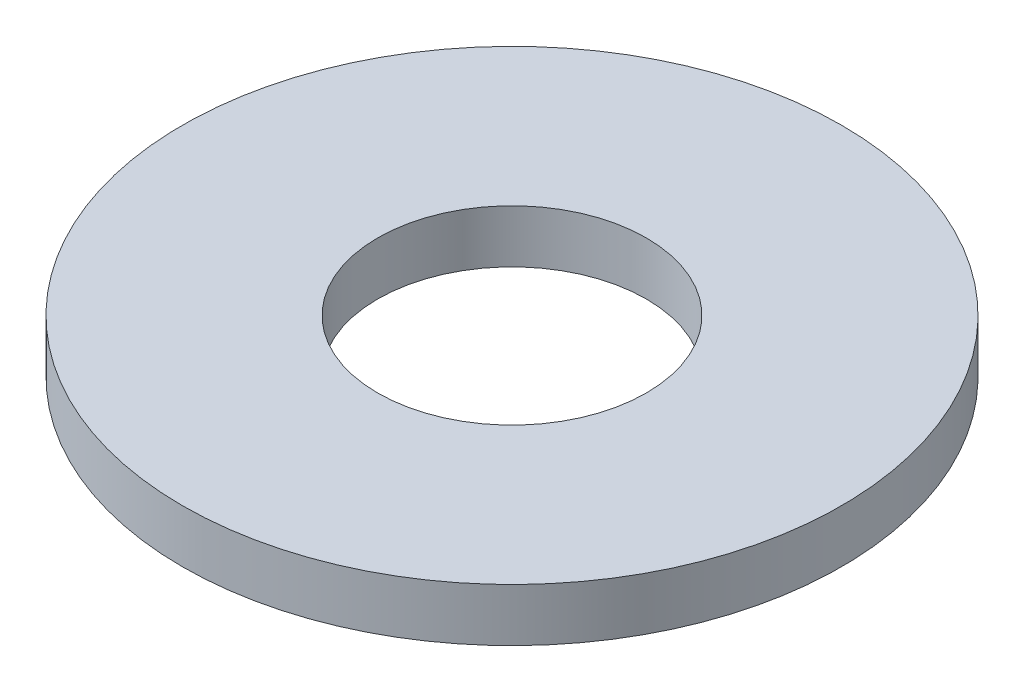
ISO-10303-21;
HEADER;
FILE_DESCRIPTION(('STEP AP214'),'2;1');
FILE_NAME('part.step','',(''),(''),'','','');
FILE_SCHEMA(('AUTOMOTIVE_DESIGN { 1 0 10303 214 1 1 1 1 }'));
ENDSEC;
DATA;
#1=APPLICATION_CONTEXT('core data for automotive mechanical design processes');
#2=APPLICATION_PROTOCOL_DEFINITION('international standard','automotive_design',2000,#1);
#3=PRODUCT_CONTEXT('',#1,'mechanical');
#4=PRODUCT('Part','Part','',(#3));
#5=PRODUCT_RELATED_PRODUCT_CATEGORY('part','',(#4));
#6=PRODUCT_DEFINITION_FORMATION('','',#4);
#7=PRODUCT_DEFINITION_CONTEXT('part definition',#1,'design');
#8=PRODUCT_DEFINITION('design','',#6,#7);
#9=PRODUCT_DEFINITION_SHAPE('','',#8);
#10=(LENGTH_UNIT() NAMED_UNIT(*) SI_UNIT(.MILLI.,.METRE.));
#11=(NAMED_UNIT(*) PLANE_ANGLE_UNIT() SI_UNIT($,.RADIAN.));
#12=(NAMED_UNIT(*) SI_UNIT($,.STERADIAN.) SOLID_ANGLE_UNIT());
#13=UNCERTAINTY_MEASURE_WITH_UNIT(LENGTH_MEASURE(1.E-05),#10,'distance_accuracy_value','');
#14=(GEOMETRIC_REPRESENTATION_CONTEXT(3) GLOBAL_UNCERTAINTY_ASSIGNED_CONTEXT((#13)) GLOBAL_UNIT_ASSIGNED_CONTEXT((#10,
#11,#12)) REPRESENTATION_CONTEXT('',''));
#15=CARTESIAN_POINT('',(0.,0.,0.));
#16=DIRECTION('',(0.,0.,1.));
#17=DIRECTION('',(1.,0.,0.));
#18=AXIS2_PLACEMENT_3D('',#15,#16,#17);
#19=CARTESIAN_POINT('',(0.,0.,0.));
#20=DIRECTION('',(0.,1.,0.));
#21=DIRECTION('',(0.,0.,1.));
#22=AXIS2_PLACEMENT_3D('',#19,#20,#21);
#23=PLANE('',#22);
#24=CARTESIAN_POINT('',(0.,0.,0.));
#25=DIRECTION('',(0.,-1.,0.));
#26=DIRECTION('',(0.,0.,-1.));
#27=AXIS2_PLACEMENT_3D('',#24,#25,#26);
#28=CIRCLE('',#27,2.5781);
#29=CARTESIAN_POINT('',(0.,0.,-2.5781));
#30=VERTEX_POINT('',#29);
#31=EDGE_CURVE('E27',#30,#30,#28,.F.);
#32=ORIENTED_EDGE('',*,*,#31,.T.);
#33=EDGE_LOOP('',(#32));
#34=FACE_BOUND('',#33,.T.);
#35=CARTESIAN_POINT('',(0.,0.,0.));
#36=DIRECTION('',(0.,-1.,0.));
#37=DIRECTION('',(0.,0.,-1.));
#38=AXIS2_PLACEMENT_3D('',#35,#36,#37);
#39=CIRCLE('',#38,6.3246);
#40=CARTESIAN_POINT('',(0.,0.,-6.3246));
#41=VERTEX_POINT('',#40);
#42=EDGE_CURVE('E36',#41,#41,#39,.F.);
#43=ORIENTED_EDGE('',*,*,#42,.F.);
#44=EDGE_LOOP('',(#43));
#45=FACE_BOUND('',#44,.T.);
#46=ADVANCED_FACE('F15',(#34,#45),#23,.F.);
#47=CARTESIAN_POINT('',(0.,1.01600000000002,0.));
#48=DIRECTION('',(0.,-1.,0.));
#49=DIRECTION('',(0.,0.,-1.));
#50=AXIS2_PLACEMENT_3D('',#47,#48,#49);
#51=CYLINDRICAL_SURFACE('',#50,6.3246);
#52=ORIENTED_EDGE('',*,*,#42,.T.);
#53=EDGE_LOOP('',(#52));
#54=FACE_BOUND('',#53,.T.);
#55=CARTESIAN_POINT('',(0.,1.01600000000002,0.));
#56=DIRECTION('',(0.,-1.,0.));
#57=DIRECTION('',(0.,0.,-1.));
#58=AXIS2_PLACEMENT_3D('',#55,#56,#57);
#59=CIRCLE('',#58,6.3246);
#60=CARTESIAN_POINT('',(0.,1.01600000000002,-6.3246));
#61=VERTEX_POINT('',#60);
#62=EDGE_CURVE('E22',#61,#61,#59,.F.);
#63=ORIENTED_EDGE('',*,*,#62,.F.);
#64=EDGE_LOOP('',(#63));
#65=FACE_BOUND('',#64,.T.);
#66=ADVANCED_FACE('F41',(#54,#65),#51,.T.);
#67=CARTESIAN_POINT('',(0.,1.01600000000002,0.));
#68=DIRECTION('',(0.,-1.,0.));
#69=DIRECTION('',(0.,0.,-1.));
#70=AXIS2_PLACEMENT_3D('',#67,#68,#69);
#71=CYLINDRICAL_SURFACE('',#70,2.5781);
#72=ORIENTED_EDGE('',*,*,#31,.F.);
#73=EDGE_LOOP('',(#72));
#74=FACE_BOUND('',#73,.T.);
#75=CARTESIAN_POINT('',(0.,1.01600000000002,0.));
#76=DIRECTION('',(0.,-1.,0.));
#77=DIRECTION('',(0.,0.,-1.));
#78=AXIS2_PLACEMENT_3D('',#75,#76,#77);
#79=CIRCLE('',#78,2.5781);
#80=CARTESIAN_POINT('',(0.,1.01600000000002,-2.5781));
#81=VERTEX_POINT('',#80);
#82=EDGE_CURVE('E10',#81,#81,#79,.T.);
#83=ORIENTED_EDGE('',*,*,#82,.F.);
#84=EDGE_LOOP('',(#83));
#85=FACE_BOUND('',#84,.T.);
#86=ADVANCED_FACE('F50',(#74,#85),#71,.F.);
#87=CARTESIAN_POINT('',(0.,1.01600000000002,0.));
#88=DIRECTION('',(0.,1.,0.));
#89=DIRECTION('',(0.,0.,1.));
#90=AXIS2_PLACEMENT_3D('',#87,#88,#89);
#91=PLANE('',#90);
#92=ORIENTED_EDGE('',*,*,#82,.T.);
#93=EDGE_LOOP('',(#92));
#94=FACE_BOUND('',#93,.T.);
#95=ORIENTED_EDGE('',*,*,#62,.T.);
#96=EDGE_LOOP('',(#95));
#97=FACE_BOUND('',#96,.T.);
#98=ADVANCED_FACE('F51',(#94,#97),#91,.T.);
#99=CLOSED_SHELL('',(#46,#66,#86,#98));
#100=MANIFOLD_SOLID_BREP('B1',#99);
#101=ADVANCED_BREP_SHAPE_REPRESENTATION('',(#18,#100),#14);
#102=SHAPE_DEFINITION_REPRESENTATION(#9,#101);
ENDSEC;
END-ISO-10303-21;
